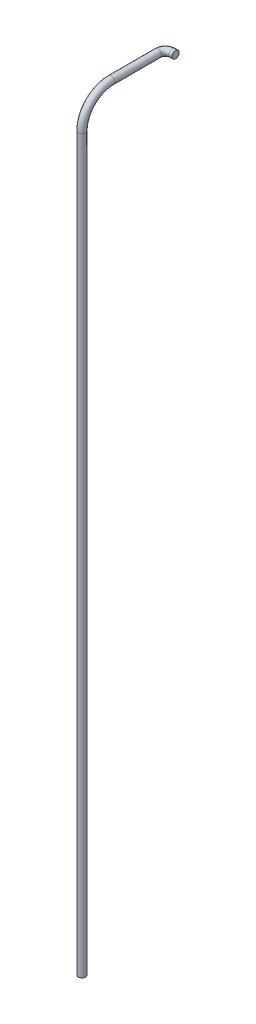
ISO-10303-21;
HEADER;
FILE_DESCRIPTION(('STEP AP214'),'2;1');
FILE_NAME('part.step','',(''),(''),'','','');
FILE_SCHEMA(('AUTOMOTIVE_DESIGN { 1 0 10303 214 1 1 1 1 }'));
ENDSEC;
DATA;
#1=APPLICATION_CONTEXT('core data for automotive mechanical design processes');
#2=APPLICATION_PROTOCOL_DEFINITION('international standard','automotive_design',2000,#1);
#3=PRODUCT_CONTEXT('',#1,'mechanical');
#4=PRODUCT('Part','Part','',(#3));
#5=PRODUCT_RELATED_PRODUCT_CATEGORY('part','',(#4));
#6=PRODUCT_DEFINITION_FORMATION('','',#4);
#7=PRODUCT_DEFINITION_CONTEXT('part definition',#1,'design');
#8=PRODUCT_DEFINITION('design','',#6,#7);
#9=PRODUCT_DEFINITION_SHAPE('','',#8);
#10=(LENGTH_UNIT() NAMED_UNIT(*) SI_UNIT(.MILLI.,.METRE.));
#11=(NAMED_UNIT(*) PLANE_ANGLE_UNIT() SI_UNIT($,.RADIAN.));
#12=(NAMED_UNIT(*) SI_UNIT($,.STERADIAN.) SOLID_ANGLE_UNIT());
#13=UNCERTAINTY_MEASURE_WITH_UNIT(LENGTH_MEASURE(1.E-05),#10,'distance_accuracy_value','');
#14=(GEOMETRIC_REPRESENTATION_CONTEXT(3) GLOBAL_UNCERTAINTY_ASSIGNED_CONTEXT((#13)) GLOBAL_UNIT_ASSIGNED_CONTEXT((#10,
#11,#12)) REPRESENTATION_CONTEXT('',''));
#15=CARTESIAN_POINT('',(0.,0.,0.));
#16=DIRECTION('',(0.,0.,1.));
#17=DIRECTION('',(1.,0.,0.));
#18=AXIS2_PLACEMENT_3D('',#15,#16,#17);
#19=CARTESIAN_POINT('',(0.,-520.,49.9999999999999));
#20=DIRECTION('',(0.,1.,0.));
#21=DIRECTION('',(0.,0.,1.));
#22=AXIS2_PLACEMENT_3D('',#19,#20,#21);
#23=PLANE('',#22);
#24=CARTESIAN_POINT('',(0.,-520.,49.9999999999999));
#25=DIRECTION('',(0.,1.,0.));
#26=DIRECTION('',(0.,0.,1.));
#27=AXIS2_PLACEMENT_3D('',#24,#25,#26);
#28=CIRCLE('',#27,2.5);
#29=CARTESIAN_POINT('',(0.,-520.,52.4999999999999));
#30=VERTEX_POINT('',#29);
#31=EDGE_CURVE('E12',#30,#30,#28,.T.);
#32=ORIENTED_EDGE('',*,*,#31,.F.);
#33=EDGE_LOOP('',(#32));
#34=FACE_BOUND('',#33,.T.);
#35=ADVANCED_FACE('F58',(#34),#23,.F.);
#36=CARTESIAN_POINT('',(0.,0.,0.));
#37=DIRECTION('',(0.,0.,1.));
#38=DIRECTION('',(0.,-1.,0.));
#39=AXIS2_PLACEMENT_3D('',#36,#37,#38);
#40=CYLINDRICAL_SURFACE('',#39,2.5);
#41=CARTESIAN_POINT('',(0.,0.,30.));
#42=DIRECTION('',(0.,0.,-1.));
#43=DIRECTION('',(0.,1.,0.));
#44=AXIS2_PLACEMENT_3D('',#41,#42,#43);
#45=CIRCLE('',#44,2.5);
#46=CARTESIAN_POINT('',(0.,2.49999999999999,30.));
#47=VERTEX_POINT('',#46);
#48=EDGE_CURVE('E76',#47,#47,#45,.T.);
#49=ORIENTED_EDGE('',*,*,#48,.T.);
#50=EDGE_LOOP('',(#49));
#51=FACE_BOUND('',#50,.T.);
#52=CARTESIAN_POINT('',(0.,0.,-2.));
#53=DIRECTION('',(0.,0.,1.));
#54=DIRECTION('',(1.,0.,0.));
#55=AXIS2_PLACEMENT_3D('',#52,#53,#54);
#56=CIRCLE('',#55,2.5);
#57=CARTESIAN_POINT('',(-2.5,0.,-2.));
#58=VERTEX_POINT('',#57);
#59=EDGE_CURVE('E82',#58,#58,#56,.T.);
#60=ORIENTED_EDGE('',*,*,#59,.T.);
#61=EDGE_LOOP('',(#60));
#62=FACE_BOUND('',#61,.T.);
#63=ADVANCED_FACE('F100',(#51,#62),#40,.T.);
#64=CARTESIAN_POINT('',(0.,-20.,30.));
#65=DIRECTION('',(1.,0.,0.));
#66=DIRECTION('',(0.,0.,-1.));
#67=AXIS2_PLACEMENT_3D('',#64,#65,#66);
#68=TOROIDAL_SURFACE('',#67,20.,2.5);
#69=CARTESIAN_POINT('',(0.,-20.,49.9999999999999));
#70=DIRECTION('',(0.,1.,0.));
#71=DIRECTION('',(0.,0.,1.));
#72=AXIS2_PLACEMENT_3D('',#69,#70,#71);
#73=CIRCLE('',#72,2.5);
#74=CARTESIAN_POINT('',(0.,-20.,52.5));
#75=VERTEX_POINT('',#74);
#76=EDGE_CURVE('E65',#75,#75,#73,.T.);
#77=CARTESIAN_POINT('',(0.,-20.,30.));
#78=DIRECTION('',(1.,0.,0.));
#79=DIRECTION('',(0.,0.,-1.));
#80=AXIS2_PLACEMENT_3D('',#77,#78,#79);
#81=CIRCLE('',#80,22.5);
#82=EDGE_CURVE('',#47,#75,#81,.T.);
#83=ORIENTED_EDGE('',*,*,#48,.F.);
#84=ORIENTED_EDGE('',*,*,#76,.T.);
#85=ORIENTED_EDGE('',*,*,#82,.T.);
#86=ORIENTED_EDGE('',*,*,#82,.F.);
#87=EDGE_LOOP('',(#83,#85,#84,#86));
#88=FACE_BOUND('',#87,.T.);
#89=ADVANCED_FACE('F88',(#88),#68,.T.);
#90=CARTESIAN_POINT('',(0.,-20.,50.));
#91=DIRECTION('',(0.,-1.,0.));
#92=DIRECTION('',(0.,0.,-1.));
#93=AXIS2_PLACEMENT_3D('',#90,#91,#92);
#94=CYLINDRICAL_SURFACE('',#93,2.5);
#95=ORIENTED_EDGE('',*,*,#31,.T.);
#96=EDGE_LOOP('',(#95));
#97=FACE_BOUND('',#96,.T.);
#98=ORIENTED_EDGE('',*,*,#76,.F.);
#99=EDGE_LOOP('',(#98));
#100=FACE_BOUND('',#99,.T.);
#101=ADVANCED_FACE('F91',(#97,#100),#94,.T.);
#102=CARTESIAN_POINT('',(6.99658834039425,0.,-7.));
#103=DIRECTION('',(-1.,0.,0.));
#104=DIRECTION('',(0.,0.,1.));
#105=AXIS2_PLACEMENT_3D('',#102,#103,#104);
#106=PLANE('',#105);
#107=CARTESIAN_POINT('',(6.99658834039425,0.,-7.));
#108=DIRECTION('',(-1.,0.,0.));
#109=DIRECTION('',(0.,0.,1.));
#110=AXIS2_PLACEMENT_3D('',#107,#108,#109);
#111=CIRCLE('',#110,2.5);
#112=CARTESIAN_POINT('',(6.99658834039425,0.,-4.5));
#113=VERTEX_POINT('',#112);
#114=EDGE_CURVE('E72',#113,#113,#111,.T.);
#115=ORIENTED_EDGE('',*,*,#114,.F.);
#116=EDGE_LOOP('',(#115));
#117=FACE_BOUND('',#116,.T.);
#118=ADVANCED_FACE('F93',(#117),#106,.F.);
#119=CARTESIAN_POINT('',(5.,0.,-2.));
#120=DIRECTION('',(0.,-1.,0.));
#121=DIRECTION('',(0.,0.,-1.));
#122=AXIS2_PLACEMENT_3D('',#119,#120,#121);
#123=TOROIDAL_SURFACE('',#122,5.,2.5);
#124=CARTESIAN_POINT('',(5.,0.,-7.));
#125=DIRECTION('',(-1.,0.,0.));
#126=DIRECTION('',(0.,0.,1.));
#127=AXIS2_PLACEMENT_3D('',#124,#125,#126);
#128=CIRCLE('',#127,2.5);
#129=CARTESIAN_POINT('',(4.99999999999999,0.,-9.5));
#130=VERTEX_POINT('',#129);
#131=EDGE_CURVE('E77',#130,#130,#128,.T.);
#132=CARTESIAN_POINT('',(5.,0.,-2.));
#133=DIRECTION('',(0.,-1.,0.));
#134=DIRECTION('',(0.,0.,-1.));
#135=AXIS2_PLACEMENT_3D('',#132,#133,#134);
#136=CIRCLE('',#135,7.5);
#137=EDGE_CURVE('',#58,#130,#136,.T.);
#138=ORIENTED_EDGE('',*,*,#59,.F.);
#139=ORIENTED_EDGE('',*,*,#131,.T.);
#140=ORIENTED_EDGE('',*,*,#137,.T.);
#141=ORIENTED_EDGE('',*,*,#137,.F.);
#142=EDGE_LOOP('',(#138,#140,#139,#141));
#143=FACE_BOUND('',#142,.T.);
#144=ADVANCED_FACE('F98',(#143),#123,.T.);
#145=CARTESIAN_POINT('',(5.,0.,-7.));
#146=DIRECTION('',(1.,0.,0.));
#147=DIRECTION('',(0.,0.,-1.));
#148=AXIS2_PLACEMENT_3D('',#145,#146,#147);
#149=CYLINDRICAL_SURFACE('',#148,2.5);
#150=ORIENTED_EDGE('',*,*,#114,.T.);
#151=EDGE_LOOP('',(#150));
#152=FACE_BOUND('',#151,.T.);
#153=ORIENTED_EDGE('',*,*,#131,.F.);
#154=EDGE_LOOP('',(#153));
#155=FACE_BOUND('',#154,.T.);
#156=ADVANCED_FACE('F73',(#152,#155),#149,.T.);
#157=CLOSED_SHELL('',(#35,#63,#89,#101,#118,#144,#156));
#158=MANIFOLD_SOLID_BREP('B2',#157);
#159=ADVANCED_BREP_SHAPE_REPRESENTATION('',(#18,#158),#14);
#160=SHAPE_DEFINITION_REPRESENTATION(#9,#159);
ENDSEC;
END-ISO-10303-21;
